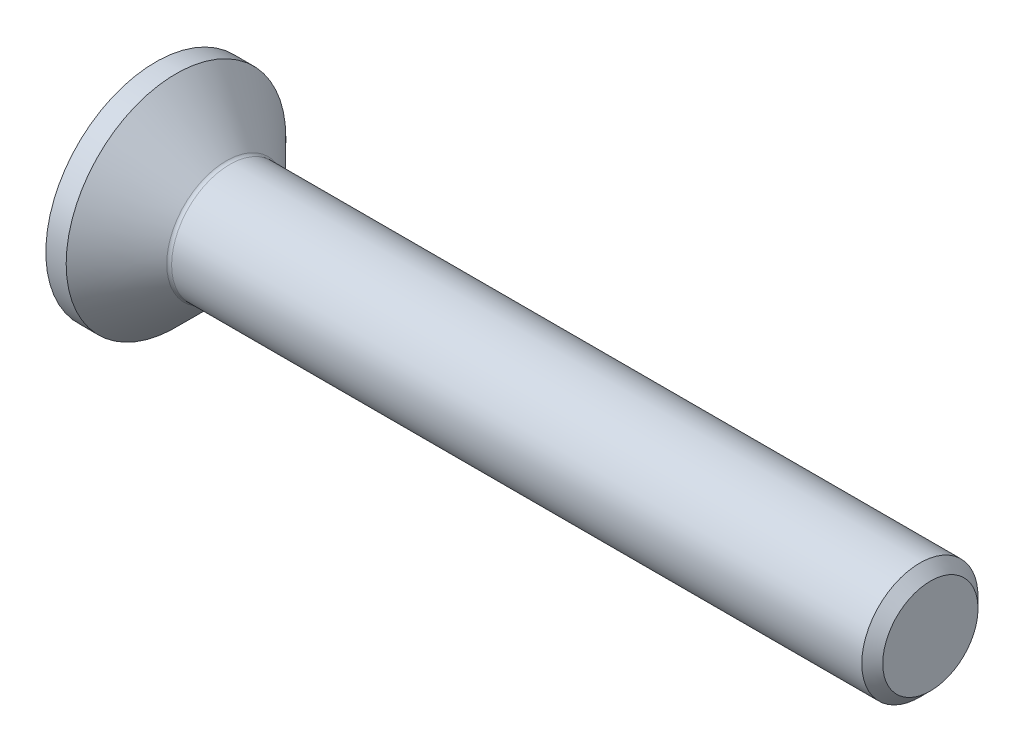
ISO-10303-21;
HEADER;
FILE_DESCRIPTION(('STEP AP214'),'2;1');
FILE_NAME('part.step','',(''),(''),'','','');
FILE_SCHEMA(('AUTOMOTIVE_DESIGN { 1 0 10303 214 1 1 1 1 }'));
ENDSEC;
DATA;
#1=APPLICATION_CONTEXT('core data for automotive mechanical design processes');
#2=APPLICATION_PROTOCOL_DEFINITION('international standard','automotive_design',2000,#1);
#3=PRODUCT_CONTEXT('',#1,'mechanical');
#4=PRODUCT('Part','Part','',(#3));
#5=PRODUCT_RELATED_PRODUCT_CATEGORY('part','',(#4));
#6=PRODUCT_DEFINITION_FORMATION('','',#4);
#7=PRODUCT_DEFINITION_CONTEXT('part definition',#1,'design');
#8=PRODUCT_DEFINITION('design','',#6,#7);
#9=PRODUCT_DEFINITION_SHAPE('','',#8);
#10=(LENGTH_UNIT() NAMED_UNIT(*) SI_UNIT(.MILLI.,.METRE.));
#11=(NAMED_UNIT(*) PLANE_ANGLE_UNIT() SI_UNIT($,.RADIAN.));
#12=(NAMED_UNIT(*) SI_UNIT($,.STERADIAN.) SOLID_ANGLE_UNIT());
#13=UNCERTAINTY_MEASURE_WITH_UNIT(LENGTH_MEASURE(1.E-05),#10,'distance_accuracy_value','');
#14=(GEOMETRIC_REPRESENTATION_CONTEXT(3) GLOBAL_UNCERTAINTY_ASSIGNED_CONTEXT((#13)) GLOBAL_UNIT_ASSIGNED_CONTEXT((#10,
#11,#12)) REPRESENTATION_CONTEXT('',''));
#15=CARTESIAN_POINT('',(0.,0.,0.));
#16=DIRECTION('',(0.,0.,1.));
#17=DIRECTION('',(1.,0.,0.));
#18=AXIS2_PLACEMENT_3D('',#15,#16,#17);
#19=CARTESIAN_POINT('',(3.72,0.,0.));
#20=DIRECTION('',(-1.,0.,0.));
#21=DIRECTION('',(0.,0.,1.));
#22=AXIS2_PLACEMENT_3D('',#19,#20,#21);
#23=CONICAL_SURFACE('',#22,3.,0.785398163397448);
#24=CARTESIAN_POINT('',(1.05,0.,0.));
#25=DIRECTION('',(-1.,0.,0.));
#26=DIRECTION('',(0.,0.,1.));
#27=AXIS2_PLACEMENT_3D('',#24,#25,#26);
#28=CIRCLE('',#27,5.67);
#29=CARTESIAN_POINT('',(1.05,0.,5.67));
#30=VERTEX_POINT('',#29);
#31=EDGE_CURVE('E43',#30,#30,#28,.F.);
#32=ORIENTED_EDGE('',*,*,#31,.T.);
#33=EDGE_LOOP('',(#32));
#34=FACE_BOUND('',#33,.T.);
#35=CARTESIAN_POINT('',(3.64677669529664,0.,0.));
#36=DIRECTION('',(-1.,0.,0.));
#37=DIRECTION('',(0.,0.,1.));
#38=AXIS2_PLACEMENT_3D('',#35,#36,#37);
#39=CIRCLE('',#38,3.07322330470336);
#40=CARTESIAN_POINT('',(3.64677669529664,0.,3.07322330470336));
#41=VERTEX_POINT('',#40);
#42=EDGE_CURVE('E162',#41,#41,#39,.T.);
#43=ORIENTED_EDGE('',*,*,#42,.T.);
#44=EDGE_LOOP('',(#43));
#45=FACE_BOUND('',#44,.T.);
#46=ADVANCED_FACE('F39',(#34,#45),#23,.T.);
#47=CARTESIAN_POINT('',(-0.587069180985524,0.,0.));
#48=DIRECTION('',(-1.,0.,0.));
#49=DIRECTION('',(0.,0.,1.));
#50=AXIS2_PLACEMENT_3D('',#47,#48,#49);
#51=CYLINDRICAL_SURFACE('',#50,3.);
#52=CARTESIAN_POINT('',(39.4585,0.,0.));
#53=DIRECTION('',(-1.,0.,0.));
#54=DIRECTION('',(0.,0.,1.));
#55=AXIS2_PLACEMENT_3D('',#52,#53,#54);
#56=CIRCLE('',#55,3.);
#57=CARTESIAN_POINT('',(39.4585,0.,3.));
#58=VERTEX_POINT('',#57);
#59=EDGE_CURVE('E48',#58,#58,#56,.T.);
#60=ORIENTED_EDGE('',*,*,#59,.T.);
#61=EDGE_LOOP('',(#60));
#62=FACE_BOUND('',#61,.T.);
#63=CARTESIAN_POINT('',(3.82355339059327,0.,0.));
#64=DIRECTION('',(-1.,0.,0.));
#65=DIRECTION('',(0.,0.,1.));
#66=AXIS2_PLACEMENT_3D('',#63,#64,#65);
#67=CIRCLE('',#66,3.);
#68=CARTESIAN_POINT('',(3.82355339059327,0.,3.));
#69=VERTEX_POINT('',#68);
#70=EDGE_CURVE('E159',#69,#69,#67,.F.);
#71=ORIENTED_EDGE('',*,*,#70,.T.);
#72=EDGE_LOOP('',(#71));
#73=FACE_BOUND('',#72,.T.);
#74=ADVANCED_FACE('F130',(#62,#73),#51,.T.);
#75=CARTESIAN_POINT('',(40.,3.,0.));
#76=DIRECTION('',(-1.,0.,0.));
#77=DIRECTION('',(0.,0.,1.));
#78=AXIS2_PLACEMENT_3D('',#75,#76,#77);
#79=PLANE('',#78);
#80=CARTESIAN_POINT('',(40.,0.,0.));
#81=DIRECTION('',(-1.,0.,0.));
#82=DIRECTION('',(0.,0.,1.));
#83=AXIS2_PLACEMENT_3D('',#80,#81,#82);
#84=CIRCLE('',#83,2.45849999999999);
#85=CARTESIAN_POINT('',(40.,0.,2.45849999999999));
#86=VERTEX_POINT('',#85);
#87=EDGE_CURVE('E11',#86,#86,#84,.F.);
#88=ORIENTED_EDGE('',*,*,#87,.T.);
#89=EDGE_LOOP('',(#88));
#90=FACE_BOUND('',#89,.T.);
#91=ADVANCED_FACE('F136',(#90),#79,.F.);
#92=CARTESIAN_POINT('',(3.82355339059327,0.,0.));
#93=DIRECTION('',(-1.,0.,0.));
#94=DIRECTION('',(0.,0.,1.));
#95=AXIS2_PLACEMENT_3D('',#92,#93,#94);
#96=TOROIDAL_SURFACE('',#95,3.25,0.25);
#97=ORIENTED_EDGE('',*,*,#70,.F.);
#98=EDGE_LOOP('',(#97));
#99=FACE_BOUND('',#98,.T.);
#100=ORIENTED_EDGE('',*,*,#42,.F.);
#101=EDGE_LOOP('',(#100));
#102=FACE_BOUND('',#101,.T.);
#103=ADVANCED_FACE('F147',(#99,#102),#96,.F.);
#104=CARTESIAN_POINT('',(39.4585,0.,0.));
#105=DIRECTION('',(-1.,0.,0.));
#106=DIRECTION('',(0.,0.,1.));
#107=AXIS2_PLACEMENT_3D('',#104,#105,#106);
#108=CONICAL_SURFACE('',#107,3.,0.785398163397438);
#109=ORIENTED_EDGE('',*,*,#87,.F.);
#110=EDGE_LOOP('',(#109));
#111=FACE_BOUND('',#110,.T.);
#112=ORIENTED_EDGE('',*,*,#59,.F.);
#113=EDGE_LOOP('',(#112));
#114=FACE_BOUND('',#113,.T.);
#115=ADVANCED_FACE('F41',(#111,#114),#108,.T.);
#116=CARTESIAN_POINT('',(11.8531386861314,0.,0.));
#117=DIRECTION('',(1.,0.,0.));
#118=DIRECTION('',(0.,0.,-1.));
#119=AXIS2_PLACEMENT_3D('',#116,#117,#118);
#120=CYLINDRICAL_SURFACE('',#119,5.67);
#121=ORIENTED_EDGE('',*,*,#31,.F.);
#122=EDGE_LOOP('',(#121));
#123=FACE_BOUND('',#122,.T.);
#124=CARTESIAN_POINT('',(0.,0.,0.));
#125=DIRECTION('',(1.,0.,0.));
#126=DIRECTION('',(0.,0.,-1.));
#127=AXIS2_PLACEMENT_3D('',#124,#125,#126);
#128=CIRCLE('',#127,5.67);
#129=CARTESIAN_POINT('',(0.,0.,-5.67));
#130=VERTEX_POINT('',#129);
#131=EDGE_CURVE('E228',#130,#130,#128,.F.);
#132=ORIENTED_EDGE('',*,*,#131,.F.);
#133=EDGE_LOOP('',(#132));
#134=FACE_BOUND('',#133,.T.);
#135=ADVANCED_FACE('F117',(#123,#134),#120,.T.);
#136=CARTESIAN_POINT('',(3.35470053837925,0.,0.));
#137=DIRECTION('',(-1.,0.,0.));
#138=DIRECTION('',(0.,0.,1.));
#139=AXIS2_PLACEMENT_3D('',#136,#137,#138);
#140=CONICAL_SURFACE('',#139,0.,1.0471975511966);
#141=CARTESIAN_POINT('',(2.2,0.,0.));
#142=DIRECTION('',(-1.,0.,0.));
#143=DIRECTION('',(0.,0.,1.));
#144=AXIS2_PLACEMENT_3D('',#141,#142,#143);
#145=CIRCLE('',#144,2.);
#146=CARTESIAN_POINT('',(2.2,1.,1.73205080756888));
#147=VERTEX_POINT('',#146);
#148=CARTESIAN_POINT('',(2.2,2.,0.));
#149=VERTEX_POINT('',#148);
#150=EDGE_CURVE('E168',#147,#149,#145,.T.);
#151=ORIENTED_EDGE('',*,*,#150,.T.);
#152=CARTESIAN_POINT('',(2.2,1.,-1.73205080756888));
#153=VERTEX_POINT('',#152);
#154=EDGE_CURVE('E163',#149,#153,#145,.T.);
#155=ORIENTED_EDGE('',*,*,#154,.T.);
#156=CARTESIAN_POINT('',(2.2,-1.,-1.73205080756888));
#157=VERTEX_POINT('',#156);
#158=EDGE_CURVE('E166',#153,#157,#145,.T.);
#159=ORIENTED_EDGE('',*,*,#158,.T.);
#160=CARTESIAN_POINT('',(2.2,-2.,0.));
#161=VERTEX_POINT('',#160);
#162=EDGE_CURVE('E247',#157,#161,#145,.T.);
#163=ORIENTED_EDGE('',*,*,#162,.T.);
#164=CARTESIAN_POINT('',(2.2,-1.,1.73205080756888));
#165=VERTEX_POINT('',#164);
#166=EDGE_CURVE('E55',#161,#165,#145,.T.);
#167=ORIENTED_EDGE('',*,*,#166,.T.);
#168=EDGE_CURVE('E177',#165,#147,#145,.T.);
#169=ORIENTED_EDGE('',*,*,#168,.T.);
#170=EDGE_LOOP('',(#151,#155,#159,#163,#167,#169));
#171=FACE_BOUND('',#170,.T.);
#172=CARTESIAN_POINT('',(3.35470053837925,0.,0.));
#173=VERTEX_POINT('',#172);
#174=VERTEX_LOOP('',#173);
#175=FACE_BOUND('',#174,.T.);
#176=ADVANCED_FACE('F114',(#171,#175),#140,.F.);
#177=CARTESIAN_POINT('',(2.2,0.,-2.3094010767585));
#178=DIRECTION('',(1.,0.,0.));
#179=DIRECTION('',(0.,0.,-1.));
#180=AXIS2_PLACEMENT_3D('',#177,#178,#179);
#181=PLANE('',#180);
#182=ORIENTED_EDGE('',*,*,#166,.F.);
#183=DIRECTION('',(0.,0.,-1.));
#184=VECTOR('',#183,1.);
#185=CARTESIAN_POINT('',(2.2,-2.,1.15470053837925));
#186=LINE('',#185,#184);
#187=CARTESIAN_POINT('',(2.2,-2.,1.15470053837925));
#188=VERTEX_POINT('',#187);
#189=EDGE_CURVE('E188',#188,#161,#186,.T.);
#190=ORIENTED_EDGE('',*,*,#189,.F.);
#191=DIRECTION('',(0.,-0.866025403784439,-0.5));
#192=VECTOR('',#191,1.);
#193=CARTESIAN_POINT('',(2.2,0.,2.3094010767585));
#194=LINE('',#193,#192);
#195=EDGE_CURVE('E212',#165,#188,#194,.T.);
#196=ORIENTED_EDGE('',*,*,#195,.F.);
#197=EDGE_LOOP('',(#182,#190,#196));
#198=FACE_BOUND('',#197,.T.);
#199=ADVANCED_FACE('F116',(#198),#181,.F.);
#200=ORIENTED_EDGE('',*,*,#168,.F.);
#201=CARTESIAN_POINT('',(2.2,0.,2.3094010767585));
#202=VERTEX_POINT('',#201);
#203=EDGE_CURVE('E209',#202,#165,#194,.T.);
#204=ORIENTED_EDGE('',*,*,#203,.F.);
#205=DIRECTION('',(0.,-0.866025403784438,0.5));
#206=VECTOR('',#205,1.);
#207=CARTESIAN_POINT('',(2.2,2.,1.15470053837925));
#208=LINE('',#207,#206);
#209=EDGE_CURVE('E216',#147,#202,#208,.T.);
#210=ORIENTED_EDGE('',*,*,#209,.F.);
#211=EDGE_LOOP('',(#200,#204,#210));
#212=FACE_BOUND('',#211,.T.);
#213=ADVANCED_FACE('F123',(#212),#181,.F.);
#214=ORIENTED_EDGE('',*,*,#150,.F.);
#215=CARTESIAN_POINT('',(2.2,2.,1.15470053837925));
#216=VERTEX_POINT('',#215);
#217=EDGE_CURVE('E213',#216,#147,#208,.T.);
#218=ORIENTED_EDGE('',*,*,#217,.F.);
#219=DIRECTION('',(0.,0.,1.));
#220=VECTOR('',#219,1.);
#221=CARTESIAN_POINT('',(2.2,2.,-1.15470053837925));
#222=LINE('',#221,#220);
#223=EDGE_CURVE('E220',#149,#216,#222,.T.);
#224=ORIENTED_EDGE('',*,*,#223,.F.);
#225=EDGE_LOOP('',(#214,#218,#224));
#226=FACE_BOUND('',#225,.T.);
#227=ADVANCED_FACE('F278',(#226),#181,.F.);
#228=ORIENTED_EDGE('',*,*,#154,.F.);
#229=CARTESIAN_POINT('',(2.2,2.,-1.15470053837925));
#230=VERTEX_POINT('',#229);
#231=EDGE_CURVE('E217',#230,#149,#222,.T.);
#232=ORIENTED_EDGE('',*,*,#231,.F.);
#233=DIRECTION('',(0.,0.866025403784438,0.5));
#234=VECTOR('',#233,1.);
#235=CARTESIAN_POINT('',(2.2,0.,-2.3094010767585));
#236=LINE('',#235,#234);
#237=EDGE_CURVE('E224',#153,#230,#236,.T.);
#238=ORIENTED_EDGE('',*,*,#237,.F.);
#239=EDGE_LOOP('',(#228,#232,#238));
#240=FACE_BOUND('',#239,.T.);
#241=ADVANCED_FACE('F283',(#240),#181,.F.);
#242=ORIENTED_EDGE('',*,*,#158,.F.);
#243=CARTESIAN_POINT('',(2.2,0.,-2.3094010767585));
#244=VERTEX_POINT('',#243);
#245=EDGE_CURVE('E221',#244,#153,#236,.T.);
#246=ORIENTED_EDGE('',*,*,#245,.F.);
#247=DIRECTION('',(0.,0.866025403784439,-0.5));
#248=VECTOR('',#247,1.);
#249=CARTESIAN_POINT('',(2.2,-2.,-1.15470053837925));
#250=LINE('',#249,#248);
#251=EDGE_CURVE('E192',#157,#244,#250,.T.);
#252=ORIENTED_EDGE('',*,*,#251,.F.);
#253=EDGE_LOOP('',(#242,#246,#252));
#254=FACE_BOUND('',#253,.T.);
#255=ADVANCED_FACE('F252',(#254),#181,.F.);
#256=ORIENTED_EDGE('',*,*,#162,.F.);
#257=CARTESIAN_POINT('',(2.2,-2.,-1.15470053837925));
#258=VERTEX_POINT('',#257);
#259=EDGE_CURVE('E225',#258,#157,#250,.T.);
#260=ORIENTED_EDGE('',*,*,#259,.F.);
#261=EDGE_CURVE('E208',#161,#258,#186,.T.);
#262=ORIENTED_EDGE('',*,*,#261,.F.);
#263=EDGE_LOOP('',(#256,#260,#262));
#264=FACE_BOUND('',#263,.T.);
#265=ADVANCED_FACE('F126',(#264),#181,.F.);
#266=CARTESIAN_POINT('',(2.2,-2.,1.15470053837925));
#267=DIRECTION('',(0.,1.,0.));
#268=DIRECTION('',(0.,0.,1.));
#269=AXIS2_PLACEMENT_3D('',#266,#267,#268);
#270=PLANE('',#269);
#271=DIRECTION('',(0.,0.,-1.));
#272=VECTOR('',#271,1.);
#273=CARTESIAN_POINT('',(0.,-2.,1.15470053837925));
#274=LINE('',#273,#272);
#275=CARTESIAN_POINT('',(0.,-2.,1.15470053837925));
#276=VERTEX_POINT('',#275);
#277=CARTESIAN_POINT('',(0.,-2.,-1.15470053837925));
#278=VERTEX_POINT('',#277);
#279=EDGE_CURVE('E189',#276,#278,#274,.T.);
#280=ORIENTED_EDGE('',*,*,#279,.F.);
#281=DIRECTION('',(-1.,0.,0.));
#282=VECTOR('',#281,1.);
#283=CARTESIAN_POINT('',(2.2,-2.,1.15470053837925));
#284=LINE('',#283,#282);
#285=EDGE_CURVE('E184',#188,#276,#284,.T.);
#286=ORIENTED_EDGE('',*,*,#285,.F.);
#287=ORIENTED_EDGE('',*,*,#189,.T.);
#288=ORIENTED_EDGE('',*,*,#261,.T.);
#289=DIRECTION('',(-1.,0.,0.));
#290=VECTOR('',#289,1.);
#291=CARTESIAN_POINT('',(2.2,-2.,-1.15470053837925));
#292=LINE('',#291,#290);
#293=EDGE_CURVE('E186',#258,#278,#292,.T.);
#294=ORIENTED_EDGE('',*,*,#293,.T.);
#295=EDGE_LOOP('',(#280,#286,#287,#288,#294));
#296=FACE_BOUND('',#295,.T.);
#297=ADVANCED_FACE('F241',(#296),#270,.T.);
#298=CARTESIAN_POINT('',(2.2,0.,2.3094010767585));
#299=DIRECTION('',(0.,0.5,-0.866025403784438));
#300=DIRECTION('',(0.,0.866025403784439,0.5));
#301=AXIS2_PLACEMENT_3D('',#298,#299,#300);
#302=PLANE('',#301);
#303=DIRECTION('',(0.,-0.866025403784439,-0.5));
#304=VECTOR('',#303,1.);
#305=CARTESIAN_POINT('',(0.,0.,2.3094010767585));
#306=LINE('',#305,#304);
#307=CARTESIAN_POINT('',(0.,0.,2.3094010767585));
#308=VERTEX_POINT('',#307);
#309=EDGE_CURVE('E193',#308,#276,#306,.T.);
#310=ORIENTED_EDGE('',*,*,#309,.F.);
#311=DIRECTION('',(-1.,0.,0.));
#312=VECTOR('',#311,1.);
#313=CARTESIAN_POINT('',(2.2,0.,2.3094010767585));
#314=LINE('',#313,#312);
#315=EDGE_CURVE('E182',#202,#308,#314,.T.);
#316=ORIENTED_EDGE('',*,*,#315,.F.);
#317=ORIENTED_EDGE('',*,*,#203,.T.);
#318=ORIENTED_EDGE('',*,*,#195,.T.);
#319=ORIENTED_EDGE('',*,*,#285,.T.);
#320=EDGE_LOOP('',(#310,#316,#317,#318,#319));
#321=FACE_BOUND('',#320,.T.);
#322=ADVANCED_FACE('F271',(#321),#302,.T.);
#323=CARTESIAN_POINT('',(2.2,2.,1.15470053837925));
#324=DIRECTION('',(0.,-0.5,-0.866025403784439));
#325=DIRECTION('',(0.,0.866025403784438,-0.5));
#326=AXIS2_PLACEMENT_3D('',#323,#324,#325);
#327=PLANE('',#326);
#328=DIRECTION('',(0.,-0.866025403784438,0.5));
#329=VECTOR('',#328,1.);
#330=CARTESIAN_POINT('',(0.,2.,1.15470053837925));
#331=LINE('',#330,#329);
#332=CARTESIAN_POINT('',(0.,2.,1.15470053837925));
#333=VERTEX_POINT('',#332);
#334=EDGE_CURVE('E196',#333,#308,#331,.T.);
#335=ORIENTED_EDGE('',*,*,#334,.F.);
#336=DIRECTION('',(-1.,0.,0.));
#337=VECTOR('',#336,1.);
#338=CARTESIAN_POINT('',(2.2,2.,1.15470053837925));
#339=LINE('',#338,#337);
#340=EDGE_CURVE('E180',#216,#333,#339,.T.);
#341=ORIENTED_EDGE('',*,*,#340,.F.);
#342=ORIENTED_EDGE('',*,*,#217,.T.);
#343=ORIENTED_EDGE('',*,*,#209,.T.);
#344=ORIENTED_EDGE('',*,*,#315,.T.);
#345=EDGE_LOOP('',(#335,#341,#342,#343,#344));
#346=FACE_BOUND('',#345,.T.);
#347=ADVANCED_FACE('F265',(#346),#327,.T.);
#348=CARTESIAN_POINT('',(2.2,2.,-1.15470053837925));
#349=DIRECTION('',(0.,-1.,0.));
#350=DIRECTION('',(0.,0.,-1.));
#351=AXIS2_PLACEMENT_3D('',#348,#349,#350);
#352=PLANE('',#351);
#353=DIRECTION('',(0.,0.,1.));
#354=VECTOR('',#353,1.);
#355=CARTESIAN_POINT('',(0.,2.,-1.15470053837925));
#356=LINE('',#355,#354);
#357=CARTESIAN_POINT('',(0.,2.,-1.15470053837925));
#358=VERTEX_POINT('',#357);
#359=EDGE_CURVE('E199',#358,#333,#356,.T.);
#360=ORIENTED_EDGE('',*,*,#359,.F.);
#361=DIRECTION('',(-1.,0.,0.));
#362=VECTOR('',#361,1.);
#363=CARTESIAN_POINT('',(2.2,2.,-1.15470053837925));
#364=LINE('',#363,#362);
#365=EDGE_CURVE('E178',#230,#358,#364,.T.);
#366=ORIENTED_EDGE('',*,*,#365,.F.);
#367=ORIENTED_EDGE('',*,*,#231,.T.);
#368=ORIENTED_EDGE('',*,*,#223,.T.);
#369=ORIENTED_EDGE('',*,*,#340,.T.);
#370=EDGE_LOOP('',(#360,#366,#367,#368,#369));
#371=FACE_BOUND('',#370,.T.);
#372=ADVANCED_FACE('F261',(#371),#352,.T.);
#373=CARTESIAN_POINT('',(2.2,0.,-2.3094010767585));
#374=DIRECTION('',(0.,-0.5,0.866025403784438));
#375=DIRECTION('',(0.,-0.866025403784438,-0.5));
#376=AXIS2_PLACEMENT_3D('',#373,#374,#375);
#377=PLANE('',#376);
#378=DIRECTION('',(0.,0.866025403784438,0.5));
#379=VECTOR('',#378,1.);
#380=CARTESIAN_POINT('',(0.,0.,-2.3094010767585));
#381=LINE('',#380,#379);
#382=CARTESIAN_POINT('',(0.,0.,-2.3094010767585));
#383=VERTEX_POINT('',#382);
#384=EDGE_CURVE('E202',#383,#358,#381,.T.);
#385=ORIENTED_EDGE('',*,*,#384,.F.);
#386=DIRECTION('',(-1.,0.,0.));
#387=VECTOR('',#386,1.);
#388=CARTESIAN_POINT('',(2.2,0.,-2.3094010767585));
#389=LINE('',#388,#387);
#390=EDGE_CURVE('E170',#244,#383,#389,.T.);
#391=ORIENTED_EDGE('',*,*,#390,.F.);
#392=ORIENTED_EDGE('',*,*,#245,.T.);
#393=ORIENTED_EDGE('',*,*,#237,.T.);
#394=ORIENTED_EDGE('',*,*,#365,.T.);
#395=EDGE_LOOP('',(#385,#391,#392,#393,#394));
#396=FACE_BOUND('',#395,.T.);
#397=ADVANCED_FACE('F256',(#396),#377,.T.);
#398=CARTESIAN_POINT('',(2.2,-2.,-1.15470053837925));
#399=DIRECTION('',(0.,0.5,0.866025403784439));
#400=DIRECTION('',(0.,-0.866025403784439,0.5));
#401=AXIS2_PLACEMENT_3D('',#398,#399,#400);
#402=PLANE('',#401);
#403=DIRECTION('',(0.,0.866025403784439,-0.5));
#404=VECTOR('',#403,1.);
#405=CARTESIAN_POINT('',(0.,-2.,-1.15470053837925));
#406=LINE('',#405,#404);
#407=EDGE_CURVE('E63',#278,#383,#406,.T.);
#408=ORIENTED_EDGE('',*,*,#407,.F.);
#409=ORIENTED_EDGE('',*,*,#293,.F.);
#410=ORIENTED_EDGE('',*,*,#259,.T.);
#411=ORIENTED_EDGE('',*,*,#251,.T.);
#412=ORIENTED_EDGE('',*,*,#390,.T.);
#413=EDGE_LOOP('',(#408,#409,#410,#411,#412));
#414=FACE_BOUND('',#413,.T.);
#415=ADVANCED_FACE('F145',(#414),#402,.T.);
#416=CARTESIAN_POINT('',(0.,0.,0.));
#417=DIRECTION('',(1.,0.,0.));
#418=DIRECTION('',(0.,0.,-1.));
#419=AXIS2_PLACEMENT_3D('',#416,#417,#418);
#420=PLANE('',#419);
#421=ORIENTED_EDGE('',*,*,#131,.T.);
#422=EDGE_LOOP('',(#421));
#423=FACE_BOUND('',#422,.T.);
#424=ORIENTED_EDGE('',*,*,#407,.T.);
#425=ORIENTED_EDGE('',*,*,#384,.T.);
#426=ORIENTED_EDGE('',*,*,#359,.T.);
#427=ORIENTED_EDGE('',*,*,#334,.T.);
#428=ORIENTED_EDGE('',*,*,#309,.T.);
#429=ORIENTED_EDGE('',*,*,#279,.T.);
#430=EDGE_LOOP('',(#424,#425,#426,#427,#428,#429));
#431=FACE_BOUND('',#430,.T.);
#432=ADVANCED_FACE('F143',(#423,#431),#420,.F.);
#433=CLOSED_SHELL('',(#46,#74,#91,#103,#115,#135,#176,#199,#213,#227,#241,#255,#265,#297,#322,
#347,#372,#397,#415,#432));
#434=MANIFOLD_SOLID_BREP('B2',#433);
#435=ADVANCED_BREP_SHAPE_REPRESENTATION('',(#18,#434),#14);
#436=SHAPE_DEFINITION_REPRESENTATION(#9,#435);
ENDSEC;
END-ISO-10303-21;
